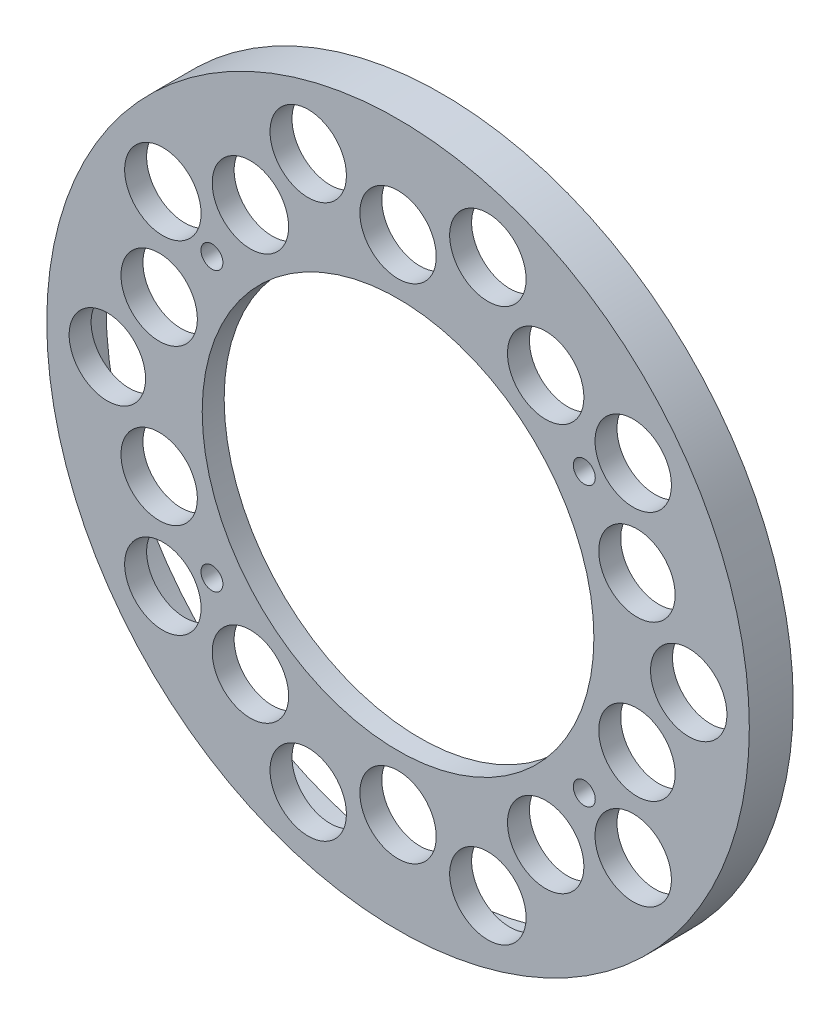
ISO-10303-21;
HEADER;
FILE_DESCRIPTION(('STEP AP214'),'2;1');
FILE_NAME('part.step','',(''),(''),'','','');
FILE_SCHEMA(('AUTOMOTIVE_DESIGN { 1 0 10303 214 1 1 1 1 }'));
ENDSEC;
DATA;
#1=APPLICATION_CONTEXT('core data for automotive mechanical design processes');
#2=APPLICATION_PROTOCOL_DEFINITION('international standard','automotive_design',2000,#1);
#3=PRODUCT_CONTEXT('',#1,'mechanical');
#4=PRODUCT('Part','Part','',(#3));
#5=PRODUCT_RELATED_PRODUCT_CATEGORY('part','',(#4));
#6=PRODUCT_DEFINITION_FORMATION('','',#4);
#7=PRODUCT_DEFINITION_CONTEXT('part definition',#1,'design');
#8=PRODUCT_DEFINITION('design','',#6,#7);
#9=PRODUCT_DEFINITION_SHAPE('','',#8);
#10=(LENGTH_UNIT() NAMED_UNIT(*) SI_UNIT(.MILLI.,.METRE.));
#11=(NAMED_UNIT(*) PLANE_ANGLE_UNIT() SI_UNIT($,.RADIAN.));
#12=(NAMED_UNIT(*) SI_UNIT($,.STERADIAN.) SOLID_ANGLE_UNIT());
#13=UNCERTAINTY_MEASURE_WITH_UNIT(LENGTH_MEASURE(1.E-05),#10,'distance_accuracy_value','');
#14=(GEOMETRIC_REPRESENTATION_CONTEXT(3) GLOBAL_UNCERTAINTY_ASSIGNED_CONTEXT((#13)) GLOBAL_UNIT_ASSIGNED_CONTEXT((#10,
#11,#12)) REPRESENTATION_CONTEXT('',''));
#15=CARTESIAN_POINT('',(0.,0.,0.));
#16=DIRECTION('',(0.,0.,1.));
#17=DIRECTION('',(1.,0.,0.));
#18=AXIS2_PLACEMENT_3D('',#15,#16,#17);
#19=CARTESIAN_POINT('',(0.,0.,0.));
#20=DIRECTION('',(0.,0.,1.));
#21=DIRECTION('',(1.,0.,0.));
#22=AXIS2_PLACEMENT_3D('',#19,#20,#21);
#23=PLANE('',#22);
#24=CARTESIAN_POINT('',(0.,0.,0.));
#25=DIRECTION('',(0.,0.,1.));
#26=DIRECTION('',(1.,0.,0.));
#27=AXIS2_PLACEMENT_3D('',#24,#25,#26);
#28=CIRCLE('',#27,56.642);
#29=CARTESIAN_POINT('',(56.642,0.,0.));
#30=VERTEX_POINT('',#29);
#31=EDGE_CURVE('E53',#30,#30,#28,.T.);
#32=ORIENTED_EDGE('',*,*,#31,.T.);
#33=EDGE_LOOP('',(#32));
#34=FACE_BOUND('',#33,.T.);
#35=CARTESIAN_POINT('',(0.,72.644,0.));
#36=DIRECTION('',(0.,0.,1.));
#37=DIRECTION('',(1.,0.,0.));
#38=AXIS2_PLACEMENT_3D('',#35,#36,#37);
#39=CIRCLE('',#38,11.049);
#40=CARTESIAN_POINT('',(11.049,72.644,0.));
#41=VERTEX_POINT('',#40);
#42=EDGE_CURVE('E70',#41,#41,#39,.T.);
#43=ORIENTED_EDGE('',*,*,#42,.T.);
#44=EDGE_LOOP('',(#43));
#45=FACE_BOUND('',#44,.T.);
#46=CARTESIAN_POINT('',(-42.6990718675336,58.7702305393742,0.));
#47=DIRECTION('',(0.,0.,1.));
#48=DIRECTION('',(1.,0.,0.));
#49=AXIS2_PLACEMENT_3D('',#46,#47,#48);
#50=CIRCLE('',#49,11.049);
#51=CARTESIAN_POINT('',(-31.6500718675337,58.7702305393742,0.));
#52=VERTEX_POINT('',#51);
#53=EDGE_CURVE('E71',#52,#52,#50,.T.);
#54=ORIENTED_EDGE('',*,*,#53,.T.);
#55=EDGE_LOOP('',(#54));
#56=FACE_BOUND('',#55,.T.);
#57=CARTESIAN_POINT('',(-69.0885495697449,22.4482305393744,0.));
#58=DIRECTION('',(0.,0.,1.));
#59=DIRECTION('',(1.,0.,0.));
#60=AXIS2_PLACEMENT_3D('',#57,#58,#59);
#61=CIRCLE('',#60,11.049);
#62=CARTESIAN_POINT('',(-58.0395495697449,22.4482305393744,0.));
#63=VERTEX_POINT('',#62);
#64=EDGE_CURVE('E77',#63,#63,#61,.T.);
#65=ORIENTED_EDGE('',*,*,#64,.T.);
#66=EDGE_LOOP('',(#65));
#67=FACE_BOUND('',#66,.T.);
#68=CARTESIAN_POINT('',(-69.0885495697454,-22.448230539373,0.));
#69=DIRECTION('',(0.,0.,1.));
#70=DIRECTION('',(1.,0.,0.));
#71=AXIS2_PLACEMENT_3D('',#68,#69,#70);
#72=CIRCLE('',#71,11.049);
#73=CARTESIAN_POINT('',(-58.0395495697454,-22.448230539373,0.));
#74=VERTEX_POINT('',#73);
#75=EDGE_CURVE('E78',#74,#74,#72,.T.);
#76=ORIENTED_EDGE('',*,*,#75,.T.);
#77=EDGE_LOOP('',(#76));
#78=FACE_BOUND('',#77,.T.);
#79=CARTESIAN_POINT('',(-42.699071867535,-58.7702305393733,0.));
#80=DIRECTION('',(0.,0.,1.));
#81=DIRECTION('',(1.,0.,0.));
#82=AXIS2_PLACEMENT_3D('',#79,#80,#81);
#83=CIRCLE('',#82,11.049);
#84=CARTESIAN_POINT('',(-31.6500718675349,-58.7702305393733,0.));
#85=VERTEX_POINT('',#84);
#86=EDGE_CURVE('E81',#85,#85,#83,.T.);
#87=ORIENTED_EDGE('',*,*,#86,.T.);
#88=EDGE_LOOP('',(#87));
#89=FACE_BOUND('',#88,.T.);
#90=CARTESIAN_POINT('',(-5.07270340757841E-13,-72.644,0.));
#91=DIRECTION('',(0.,0.,1.));
#92=DIRECTION('',(1.,0.,0.));
#93=AXIS2_PLACEMENT_3D('',#90,#91,#92);
#94=CIRCLE('',#93,11.049);
#95=CARTESIAN_POINT('',(11.0489999999995,-72.644,0.));
#96=VERTEX_POINT('',#95);
#97=EDGE_CURVE('E89',#96,#96,#94,.T.);
#98=ORIENTED_EDGE('',*,*,#97,.T.);
#99=EDGE_LOOP('',(#98));
#100=FACE_BOUND('',#99,.T.);
#101=CARTESIAN_POINT('',(42.6990718675341,-58.7702305393739,0.));
#102=DIRECTION('',(0.,0.,1.));
#103=DIRECTION('',(1.,0.,0.));
#104=AXIS2_PLACEMENT_3D('',#101,#102,#103);
#105=CIRCLE('',#104,11.049);
#106=CARTESIAN_POINT('',(53.7480718675341,-58.7702305393739,0.));
#107=VERTEX_POINT('',#106);
#108=EDGE_CURVE('E95',#107,#107,#105,.T.);
#109=ORIENTED_EDGE('',*,*,#108,.T.);
#110=EDGE_LOOP('',(#109));
#111=FACE_BOUND('',#110,.T.);
#112=CARTESIAN_POINT('',(69.0885495697451,-22.448230539374,0.));
#113=DIRECTION('',(0.,0.,1.));
#114=DIRECTION('',(1.,0.,0.));
#115=AXIS2_PLACEMENT_3D('',#112,#113,#114);
#116=CIRCLE('',#115,11.049);
#117=CARTESIAN_POINT('',(80.1375495697451,-22.448230539374,0.));
#118=VERTEX_POINT('',#117);
#119=EDGE_CURVE('E98',#118,#118,#116,.T.);
#120=ORIENTED_EDGE('',*,*,#119,.T.);
#121=EDGE_LOOP('',(#120));
#122=FACE_BOUND('',#121,.T.);
#123=CARTESIAN_POINT('',(69.0885495697452,22.4482305393735,0.));
#124=DIRECTION('',(0.,0.,1.));
#125=DIRECTION('',(1.,0.,0.));
#126=AXIS2_PLACEMENT_3D('',#123,#124,#125);
#127=CIRCLE('',#126,11.049);
#128=CARTESIAN_POINT('',(80.1375495697452,22.4482305393735,0.));
#129=VERTEX_POINT('',#128);
#130=EDGE_CURVE('E99',#129,#129,#127,.T.);
#131=ORIENTED_EDGE('',*,*,#130,.T.);
#132=EDGE_LOOP('',(#131));
#133=FACE_BOUND('',#132,.T.);
#134=CARTESIAN_POINT('',(42.6990718675345,58.7702305393736,0.));
#135=DIRECTION('',(0.,0.,1.));
#136=DIRECTION('',(1.,0.,0.));
#137=AXIS2_PLACEMENT_3D('',#134,#135,#136);
#138=CIRCLE('',#137,11.049);
#139=CARTESIAN_POINT('',(53.7480718675345,58.7702305393736,0.));
#140=VERTEX_POINT('',#139);
#141=EDGE_CURVE('E104',#140,#140,#138,.T.);
#142=ORIENTED_EDGE('',*,*,#141,.T.);
#143=EDGE_LOOP('',(#142));
#144=FACE_BOUND('',#143,.T.);
#145=CARTESIAN_POINT('',(84.074,0.,0.));
#146=DIRECTION('',(0.,0.,1.));
#147=DIRECTION('',(1.,0.,0.));
#148=AXIS2_PLACEMENT_3D('',#145,#146,#147);
#149=CIRCLE('',#148,11.049);
#150=CARTESIAN_POINT('',(95.123,0.,0.));
#151=VERTEX_POINT('',#150);
#152=EDGE_CURVE('E108',#151,#151,#149,.T.);
#153=ORIENTED_EDGE('',*,*,#152,.T.);
#154=EDGE_LOOP('',(#153));
#155=FACE_BOUND('',#154,.T.);
#156=CARTESIAN_POINT('',(68.01729478508,49.4174573012365,0.));
#157=DIRECTION('',(0.,0.,1.));
#158=DIRECTION('',(1.,0.,0.));
#159=AXIS2_PLACEMENT_3D('',#156,#157,#158);
#160=CIRCLE('',#159,11.049);
#161=CARTESIAN_POINT('',(79.06629478508,49.4174573012365,0.));
#162=VERTEX_POINT('',#161);
#163=EDGE_CURVE('E115',#162,#162,#160,.T.);
#164=ORIENTED_EDGE('',*,*,#163,.T.);
#165=EDGE_LOOP('',(#164));
#166=FACE_BOUND('',#165,.T.);
#167=CARTESIAN_POINT('',(25.9802947850802,79.9591255509985,0.));
#168=DIRECTION('',(0.,0.,1.));
#169=DIRECTION('',(1.,0.,0.));
#170=AXIS2_PLACEMENT_3D('',#167,#168,#169);
#171=CIRCLE('',#170,11.049);
#172=CARTESIAN_POINT('',(37.0292947850802,79.9591255509985,0.));
#173=VERTEX_POINT('',#172);
#174=EDGE_CURVE('E120',#173,#173,#171,.T.);
#175=ORIENTED_EDGE('',*,*,#174,.T.);
#176=EDGE_LOOP('',(#175));
#177=FACE_BOUND('',#176,.T.);
#178=CARTESIAN_POINT('',(-25.9802947850786,79.959125550999,0.));
#179=DIRECTION('',(0.,0.,1.));
#180=DIRECTION('',(1.,0.,0.));
#181=AXIS2_PLACEMENT_3D('',#178,#179,#180);
#182=CIRCLE('',#181,11.049);
#183=CARTESIAN_POINT('',(-14.9312947850786,79.959125550999,0.));
#184=VERTEX_POINT('',#183);
#185=EDGE_CURVE('E122',#184,#184,#182,.T.);
#186=ORIENTED_EDGE('',*,*,#185,.T.);
#187=EDGE_LOOP('',(#186));
#188=FACE_BOUND('',#187,.T.);
#189=CARTESIAN_POINT('',(-68.0172947850789,49.417457301238,0.));
#190=DIRECTION('',(0.,0.,1.));
#191=DIRECTION('',(1.,0.,0.));
#192=AXIS2_PLACEMENT_3D('',#189,#190,#191);
#193=CIRCLE('',#192,11.049);
#194=CARTESIAN_POINT('',(-56.9682947850789,49.417457301238,0.));
#195=VERTEX_POINT('',#194);
#196=EDGE_CURVE('E123',#195,#195,#193,.T.);
#197=ORIENTED_EDGE('',*,*,#196,.T.);
#198=EDGE_LOOP('',(#197));
#199=FACE_BOUND('',#198,.T.);
#200=CARTESIAN_POINT('',(-84.074,5.87085604163795E-13,0.));
#201=DIRECTION('',(0.,0.,1.));
#202=DIRECTION('',(1.,0.,0.));
#203=AXIS2_PLACEMENT_3D('',#200,#201,#202);
#204=CIRCLE('',#203,11.049);
#205=CARTESIAN_POINT('',(-73.025,5.87085604163795E-13,0.));
#206=VERTEX_POINT('',#205);
#207=EDGE_CURVE('E126',#206,#206,#204,.T.);
#208=ORIENTED_EDGE('',*,*,#207,.T.);
#209=EDGE_LOOP('',(#208));
#210=FACE_BOUND('',#209,.T.);
#211=CARTESIAN_POINT('',(-68.0172947850796,-49.417457301237,0.));
#212=DIRECTION('',(0.,0.,1.));
#213=DIRECTION('',(1.,0.,0.));
#214=AXIS2_PLACEMENT_3D('',#211,#212,#213);
#215=CIRCLE('',#214,11.049);
#216=CARTESIAN_POINT('',(-56.9682947850796,-49.417457301237,0.));
#217=VERTEX_POINT('',#216);
#218=EDGE_CURVE('E134',#217,#217,#215,.T.);
#219=ORIENTED_EDGE('',*,*,#218,.T.);
#220=EDGE_LOOP('',(#219));
#221=FACE_BOUND('',#220,.T.);
#222=CARTESIAN_POINT('',(-25.9802947850797,-79.9591255509986,0.));
#223=DIRECTION('',(0.,0.,1.));
#224=DIRECTION('',(1.,0.,0.));
#225=AXIS2_PLACEMENT_3D('',#222,#223,#224);
#226=CIRCLE('',#225,11.049);
#227=CARTESIAN_POINT('',(-14.9312947850797,-79.9591255509986,0.));
#228=VERTEX_POINT('',#227);
#229=EDGE_CURVE('E140',#228,#228,#226,.T.);
#230=ORIENTED_EDGE('',*,*,#229,.T.);
#231=EDGE_LOOP('',(#230));
#232=FACE_BOUND('',#231,.T.);
#233=CARTESIAN_POINT('',(25.9802947850791,-79.9591255509988,0.));
#234=DIRECTION('',(0.,0.,1.));
#235=DIRECTION('',(1.,0.,0.));
#236=AXIS2_PLACEMENT_3D('',#233,#234,#235);
#237=CIRCLE('',#236,11.049);
#238=CARTESIAN_POINT('',(37.0292947850791,-79.9591255509988,0.));
#239=VERTEX_POINT('',#238);
#240=EDGE_CURVE('E142',#239,#239,#237,.T.);
#241=ORIENTED_EDGE('',*,*,#240,.T.);
#242=EDGE_LOOP('',(#241));
#243=FACE_BOUND('',#242,.T.);
#244=CARTESIAN_POINT('',(68.0172947850793,-49.4174573012375,0.));
#245=DIRECTION('',(0.,0.,1.));
#246=DIRECTION('',(1.,0.,0.));
#247=AXIS2_PLACEMENT_3D('',#244,#245,#246);
#248=CIRCLE('',#247,11.049);
#249=CARTESIAN_POINT('',(79.0662947850793,-49.4174573012375,0.));
#250=VERTEX_POINT('',#249);
#251=EDGE_CURVE('E143',#250,#250,#248,.T.);
#252=ORIENTED_EDGE('',*,*,#251,.T.);
#253=EDGE_LOOP('',(#252));
#254=FACE_BOUND('',#253,.T.);
#255=CARTESIAN_POINT('',(53.8675558965714,40.259,0.));
#256=DIRECTION('',(0.,0.,1.));
#257=DIRECTION('',(1.,0.,0.));
#258=AXIS2_PLACEMENT_3D('',#255,#256,#257);
#259=CIRCLE('',#258,3.175);
#260=CARTESIAN_POINT('',(57.0425558965714,40.259,0.));
#261=VERTEX_POINT('',#260);
#262=EDGE_CURVE('E148',#261,#261,#259,.T.);
#263=ORIENTED_EDGE('',*,*,#262,.T.);
#264=EDGE_LOOP('',(#263));
#265=FACE_BOUND('',#264,.T.);
#266=CARTESIAN_POINT('',(-53.8284441034285,40.259,0.));
#267=DIRECTION('',(0.,0.,1.));
#268=DIRECTION('',(1.,0.,0.));
#269=AXIS2_PLACEMENT_3D('',#266,#267,#268);
#270=CIRCLE('',#269,3.175);
#271=CARTESIAN_POINT('',(-50.6534441034285,40.259,0.));
#272=VERTEX_POINT('',#271);
#273=EDGE_CURVE('E151',#272,#272,#270,.T.);
#274=ORIENTED_EDGE('',*,*,#273,.T.);
#275=EDGE_LOOP('',(#274));
#276=FACE_BOUND('',#275,.T.);
#277=CARTESIAN_POINT('',(-53.8284441034285,-40.259,0.));
#278=DIRECTION('',(0.,0.,1.));
#279=DIRECTION('',(1.,0.,0.));
#280=AXIS2_PLACEMENT_3D('',#277,#278,#279);
#281=CIRCLE('',#280,3.175);
#282=CARTESIAN_POINT('',(-50.6534441034285,-40.259,0.));
#283=VERTEX_POINT('',#282);
#284=EDGE_CURVE('E157',#283,#283,#281,.T.);
#285=ORIENTED_EDGE('',*,*,#284,.T.);
#286=EDGE_LOOP('',(#285));
#287=FACE_BOUND('',#286,.T.);
#288=CARTESIAN_POINT('',(53.8675558965714,-40.259,0.));
#289=DIRECTION('',(0.,0.,1.));
#290=DIRECTION('',(1.,0.,0.));
#291=AXIS2_PLACEMENT_3D('',#288,#289,#290);
#292=CIRCLE('',#291,3.175);
#293=CARTESIAN_POINT('',(57.0425558965714,-40.259,0.));
#294=VERTEX_POINT('',#293);
#295=EDGE_CURVE('E47',#294,#294,#292,.T.);
#296=ORIENTED_EDGE('',*,*,#295,.T.);
#297=EDGE_LOOP('',(#296));
#298=FACE_BOUND('',#297,.T.);
#299=CARTESIAN_POINT('',(0.,0.,0.));
#300=DIRECTION('',(0.,0.,-1.));
#301=DIRECTION('',(-1.,0.,0.));
#302=AXIS2_PLACEMENT_3D('',#299,#300,#301);
#303=CIRCLE('',#302,97.155);
#304=CARTESIAN_POINT('',(-97.155,0.,0.));
#305=VERTEX_POINT('',#304);
#306=EDGE_CURVE('E289',#305,#305,#303,.T.);
#307=ORIENTED_EDGE('',*,*,#306,.T.);
#308=EDGE_LOOP('',(#307));
#309=FACE_BOUND('',#308,.T.);
#310=ADVANCED_FACE('F44',(#34,#45,#56,#67,#78,#89,#100,#111,#122,#133,#144,#155,#166,#177,#188,
#199,#210,#221,#232,#243,#254,#265,#276,#287,#298,#309),#23,.F.);
#311=CARTESIAN_POINT('',(0.,0.,6.35));
#312=DIRECTION('',(0.,0.,-1.));
#313=DIRECTION('',(-1.,0.,0.));
#314=AXIS2_PLACEMENT_3D('',#311,#312,#313);
#315=CYLINDRICAL_SURFACE('',#314,101.6);
#316=CARTESIAN_POINT('',(0.,0.,6.35));
#317=DIRECTION('',(0.,0.,1.));
#318=DIRECTION('',(1.,0.,0.));
#319=AXIS2_PLACEMENT_3D('',#316,#317,#318);
#320=CIRCLE('',#319,101.6);
#321=CARTESIAN_POINT('',(101.6,0.,6.35));
#322=VERTEX_POINT('',#321);
#323=EDGE_CURVE('E10',#322,#322,#320,.T.);
#324=ORIENTED_EDGE('',*,*,#323,.F.);
#325=EDGE_LOOP('',(#324));
#326=FACE_BOUND('',#325,.T.);
#327=CARTESIAN_POINT('',(0.,0.,-6.35));
#328=DIRECTION('',(0.,0.,-1.));
#329=DIRECTION('',(-1.,0.,0.));
#330=AXIS2_PLACEMENT_3D('',#327,#328,#329);
#331=CIRCLE('',#330,101.6);
#332=CARTESIAN_POINT('',(-101.6,0.,-6.35));
#333=VERTEX_POINT('',#332);
#334=EDGE_CURVE('E279',#333,#333,#331,.T.);
#335=ORIENTED_EDGE('',*,*,#334,.F.);
#336=EDGE_LOOP('',(#335));
#337=FACE_BOUND('',#336,.T.);
#338=ADVANCED_FACE('F50',(#326,#337),#315,.T.);
#339=CARTESIAN_POINT('',(0.,0.,6.35));
#340=DIRECTION('',(0.,0.,1.));
#341=DIRECTION('',(1.,0.,0.));
#342=AXIS2_PLACEMENT_3D('',#339,#340,#341);
#343=PLANE('',#342);
#344=CARTESIAN_POINT('',(53.8675558965714,-40.259,6.35));
#345=DIRECTION('',(0.,0.,1.));
#346=DIRECTION('',(1.,0.,0.));
#347=AXIS2_PLACEMENT_3D('',#344,#345,#346);
#348=CIRCLE('',#347,3.175);
#349=CARTESIAN_POINT('',(57.0425558965714,-40.259,6.35));
#350=VERTEX_POINT('',#349);
#351=EDGE_CURVE('E273',#350,#350,#348,.T.);
#352=ORIENTED_EDGE('',*,*,#351,.F.);
#353=EDGE_LOOP('',(#352));
#354=FACE_BOUND('',#353,.T.);
#355=CARTESIAN_POINT('',(-53.8284441034285,-40.259,6.35));
#356=DIRECTION('',(0.,0.,1.));
#357=DIRECTION('',(1.,0.,0.));
#358=AXIS2_PLACEMENT_3D('',#355,#356,#357);
#359=CIRCLE('',#358,3.175);
#360=CARTESIAN_POINT('',(-50.6534441034285,-40.259,6.35));
#361=VERTEX_POINT('',#360);
#362=EDGE_CURVE('E268',#361,#361,#359,.T.);
#363=ORIENTED_EDGE('',*,*,#362,.F.);
#364=EDGE_LOOP('',(#363));
#365=FACE_BOUND('',#364,.T.);
#366=CARTESIAN_POINT('',(-53.8284441034285,40.259,6.35));
#367=DIRECTION('',(0.,0.,1.));
#368=DIRECTION('',(1.,0.,0.));
#369=AXIS2_PLACEMENT_3D('',#366,#367,#368);
#370=CIRCLE('',#369,3.175);
#371=CARTESIAN_POINT('',(-50.6534441034285,40.259,6.35));
#372=VERTEX_POINT('',#371);
#373=EDGE_CURVE('E261',#372,#372,#370,.T.);
#374=ORIENTED_EDGE('',*,*,#373,.F.);
#375=EDGE_LOOP('',(#374));
#376=FACE_BOUND('',#375,.T.);
#377=CARTESIAN_POINT('',(53.8675558965714,40.259,6.35));
#378=DIRECTION('',(0.,0.,1.));
#379=DIRECTION('',(1.,0.,0.));
#380=AXIS2_PLACEMENT_3D('',#377,#378,#379);
#381=CIRCLE('',#380,3.175);
#382=CARTESIAN_POINT('',(57.0425558965714,40.259,6.35));
#383=VERTEX_POINT('',#382);
#384=EDGE_CURVE('E153',#383,#383,#381,.T.);
#385=ORIENTED_EDGE('',*,*,#384,.F.);
#386=EDGE_LOOP('',(#385));
#387=FACE_BOUND('',#386,.T.);
#388=CARTESIAN_POINT('',(68.0172947850793,-49.4174573012375,6.35));
#389=DIRECTION('',(0.,0.,1.));
#390=DIRECTION('',(1.,0.,0.));
#391=AXIS2_PLACEMENT_3D('',#388,#389,#390);
#392=CIRCLE('',#391,11.049);
#393=CARTESIAN_POINT('',(79.0662947850793,-49.4174573012375,6.35));
#394=VERTEX_POINT('',#393);
#395=EDGE_CURVE('E184',#394,#394,#392,.T.);
#396=ORIENTED_EDGE('',*,*,#395,.F.);
#397=EDGE_LOOP('',(#396));
#398=FACE_BOUND('',#397,.T.);
#399=CARTESIAN_POINT('',(25.9802947850791,-79.9591255509988,6.35));
#400=DIRECTION('',(0.,0.,1.));
#401=DIRECTION('',(1.,0.,0.));
#402=AXIS2_PLACEMENT_3D('',#399,#400,#401);
#403=CIRCLE('',#402,11.049);
#404=CARTESIAN_POINT('',(37.0292947850791,-79.9591255509988,6.35));
#405=VERTEX_POINT('',#404);
#406=EDGE_CURVE('E189',#405,#405,#403,.T.);
#407=ORIENTED_EDGE('',*,*,#406,.F.);
#408=EDGE_LOOP('',(#407));
#409=FACE_BOUND('',#408,.T.);
#410=CARTESIAN_POINT('',(-25.9802947850797,-79.9591255509986,6.35));
#411=DIRECTION('',(0.,0.,1.));
#412=DIRECTION('',(1.,0.,0.));
#413=AXIS2_PLACEMENT_3D('',#410,#411,#412);
#414=CIRCLE('',#413,11.049);
#415=CARTESIAN_POINT('',(-14.9312947850797,-79.9591255509986,6.35));
#416=VERTEX_POINT('',#415);
#417=EDGE_CURVE('E195',#416,#416,#414,.T.);
#418=ORIENTED_EDGE('',*,*,#417,.F.);
#419=EDGE_LOOP('',(#418));
#420=FACE_BOUND('',#419,.T.);
#421=CARTESIAN_POINT('',(-68.0172947850796,-49.417457301237,6.35));
#422=DIRECTION('',(0.,0.,1.));
#423=DIRECTION('',(1.,0.,0.));
#424=AXIS2_PLACEMENT_3D('',#421,#422,#423);
#425=CIRCLE('',#424,11.049);
#426=CARTESIAN_POINT('',(-56.9682947850796,-49.417457301237,6.35));
#427=VERTEX_POINT('',#426);
#428=EDGE_CURVE('E197',#427,#427,#425,.T.);
#429=ORIENTED_EDGE('',*,*,#428,.F.);
#430=EDGE_LOOP('',(#429));
#431=FACE_BOUND('',#430,.T.);
#432=CARTESIAN_POINT('',(-84.074,5.87085604163795E-13,6.35));
#433=DIRECTION('',(0.,0.,1.));
#434=DIRECTION('',(1.,0.,0.));
#435=AXIS2_PLACEMENT_3D('',#432,#433,#434);
#436=CIRCLE('',#435,11.049);
#437=CARTESIAN_POINT('',(-73.025,5.87085604163795E-13,6.35));
#438=VERTEX_POINT('',#437);
#439=EDGE_CURVE('E196',#438,#438,#436,.T.);
#440=ORIENTED_EDGE('',*,*,#439,.F.);
#441=EDGE_LOOP('',(#440));
#442=FACE_BOUND('',#441,.T.);
#443=CARTESIAN_POINT('',(-68.0172947850789,49.417457301238,6.35));
#444=DIRECTION('',(0.,0.,1.));
#445=DIRECTION('',(1.,0.,0.));
#446=AXIS2_PLACEMENT_3D('',#443,#444,#445);
#447=CIRCLE('',#446,11.049);
#448=CARTESIAN_POINT('',(-56.9682947850789,49.417457301238,6.35));
#449=VERTEX_POINT('',#448);
#450=EDGE_CURVE('E202',#449,#449,#447,.T.);
#451=ORIENTED_EDGE('',*,*,#450,.F.);
#452=EDGE_LOOP('',(#451));
#453=FACE_BOUND('',#452,.T.);
#454=CARTESIAN_POINT('',(-25.9802947850786,79.959125550999,6.35));
#455=DIRECTION('',(0.,0.,1.));
#456=DIRECTION('',(1.,0.,0.));
#457=AXIS2_PLACEMENT_3D('',#454,#455,#456);
#458=CIRCLE('',#457,11.049);
#459=CARTESIAN_POINT('',(-14.9312947850786,79.959125550999,6.35));
#460=VERTEX_POINT('',#459);
#461=EDGE_CURVE('E179',#460,#460,#458,.T.);
#462=ORIENTED_EDGE('',*,*,#461,.F.);
#463=EDGE_LOOP('',(#462));
#464=FACE_BOUND('',#463,.T.);
#465=CARTESIAN_POINT('',(25.9802947850802,79.9591255509985,6.35));
#466=DIRECTION('',(0.,0.,1.));
#467=DIRECTION('',(1.,0.,0.));
#468=AXIS2_PLACEMENT_3D('',#465,#466,#467);
#469=CIRCLE('',#468,11.049);
#470=CARTESIAN_POINT('',(37.0292947850802,79.9591255509985,6.35));
#471=VERTEX_POINT('',#470);
#472=EDGE_CURVE('E175',#471,#471,#469,.T.);
#473=ORIENTED_EDGE('',*,*,#472,.F.);
#474=EDGE_LOOP('',(#473));
#475=FACE_BOUND('',#474,.T.);
#476=CARTESIAN_POINT('',(68.01729478508,49.4174573012365,6.35));
#477=DIRECTION('',(0.,0.,1.));
#478=DIRECTION('',(1.,0.,0.));
#479=AXIS2_PLACEMENT_3D('',#476,#477,#478);
#480=CIRCLE('',#479,11.049);
#481=CARTESIAN_POINT('',(79.06629478508,49.4174573012365,6.35));
#482=VERTEX_POINT('',#481);
#483=EDGE_CURVE('E168',#482,#482,#480,.T.);
#484=ORIENTED_EDGE('',*,*,#483,.F.);
#485=EDGE_LOOP('',(#484));
#486=FACE_BOUND('',#485,.T.);
#487=CARTESIAN_POINT('',(84.074,0.,6.35));
#488=DIRECTION('',(0.,0.,1.));
#489=DIRECTION('',(1.,0.,0.));
#490=AXIS2_PLACEMENT_3D('',#487,#488,#489);
#491=CIRCLE('',#490,11.049);
#492=CARTESIAN_POINT('',(95.123,0.,6.35));
#493=VERTEX_POINT('',#492);
#494=EDGE_CURVE('E113',#493,#493,#491,.T.);
#495=ORIENTED_EDGE('',*,*,#494,.F.);
#496=EDGE_LOOP('',(#495));
#497=FACE_BOUND('',#496,.T.);
#498=CARTESIAN_POINT('',(42.6990718675345,58.7702305393736,6.35));
#499=DIRECTION('',(0.,0.,1.));
#500=DIRECTION('',(1.,0.,0.));
#501=AXIS2_PLACEMENT_3D('',#498,#499,#500);
#502=CIRCLE('',#501,11.049);
#503=CARTESIAN_POINT('',(53.7480718675345,58.7702305393736,6.35));
#504=VERTEX_POINT('',#503);
#505=EDGE_CURVE('E217',#504,#504,#502,.T.);
#506=ORIENTED_EDGE('',*,*,#505,.F.);
#507=EDGE_LOOP('',(#506));
#508=FACE_BOUND('',#507,.T.);
#509=CARTESIAN_POINT('',(69.0885495697452,22.4482305393735,6.35));
#510=DIRECTION('',(0.,0.,1.));
#511=DIRECTION('',(1.,0.,0.));
#512=AXIS2_PLACEMENT_3D('',#509,#510,#511);
#513=CIRCLE('',#512,11.049);
#514=CARTESIAN_POINT('',(80.1375495697452,22.4482305393735,6.35));
#515=VERTEX_POINT('',#514);
#516=EDGE_CURVE('E216',#515,#515,#513,.T.);
#517=ORIENTED_EDGE('',*,*,#516,.F.);
#518=EDGE_LOOP('',(#517));
#519=FACE_BOUND('',#518,.T.);
#520=CARTESIAN_POINT('',(69.0885495697451,-22.448230539374,6.35));
#521=DIRECTION('',(0.,0.,1.));
#522=DIRECTION('',(1.,0.,0.));
#523=AXIS2_PLACEMENT_3D('',#520,#521,#522);
#524=CIRCLE('',#523,11.049);
#525=CARTESIAN_POINT('',(80.1375495697451,-22.448230539374,6.35));
#526=VERTEX_POINT('',#525);
#527=EDGE_CURVE('E222',#526,#526,#524,.T.);
#528=ORIENTED_EDGE('',*,*,#527,.F.);
#529=EDGE_LOOP('',(#528));
#530=FACE_BOUND('',#529,.T.);
#531=CARTESIAN_POINT('',(42.6990718675341,-58.7702305393739,6.35));
#532=DIRECTION('',(0.,0.,1.));
#533=DIRECTION('',(1.,0.,0.));
#534=AXIS2_PLACEMENT_3D('',#531,#532,#533);
#535=CIRCLE('',#534,11.049);
#536=CARTESIAN_POINT('',(53.7480718675341,-58.7702305393739,6.35));
#537=VERTEX_POINT('',#536);
#538=EDGE_CURVE('E227',#537,#537,#535,.T.);
#539=ORIENTED_EDGE('',*,*,#538,.F.);
#540=EDGE_LOOP('',(#539));
#541=FACE_BOUND('',#540,.T.);
#542=CARTESIAN_POINT('',(-5.07270340757841E-13,-72.644,6.35));
#543=DIRECTION('',(0.,0.,1.));
#544=DIRECTION('',(1.,0.,0.));
#545=AXIS2_PLACEMENT_3D('',#542,#543,#544);
#546=CIRCLE('',#545,11.049);
#547=CARTESIAN_POINT('',(11.0489999999995,-72.644,6.35));
#548=VERTEX_POINT('',#547);
#549=EDGE_CURVE('E233',#548,#548,#546,.T.);
#550=ORIENTED_EDGE('',*,*,#549,.F.);
#551=EDGE_LOOP('',(#550));
#552=FACE_BOUND('',#551,.T.);
#553=CARTESIAN_POINT('',(-42.699071867535,-58.7702305393733,6.35));
#554=DIRECTION('',(0.,0.,1.));
#555=DIRECTION('',(1.,0.,0.));
#556=AXIS2_PLACEMENT_3D('',#553,#554,#555);
#557=CIRCLE('',#556,11.049);
#558=CARTESIAN_POINT('',(-31.6500718675349,-58.7702305393733,6.35));
#559=VERTEX_POINT('',#558);
#560=EDGE_CURVE('E232',#559,#559,#557,.T.);
#561=ORIENTED_EDGE('',*,*,#560,.F.);
#562=EDGE_LOOP('',(#561));
#563=FACE_BOUND('',#562,.T.);
#564=CARTESIAN_POINT('',(-69.0885495697454,-22.448230539373,6.35));
#565=DIRECTION('',(0.,0.,1.));
#566=DIRECTION('',(1.,0.,0.));
#567=AXIS2_PLACEMENT_3D('',#564,#565,#566);
#568=CIRCLE('',#567,11.049);
#569=CARTESIAN_POINT('',(-58.0395495697454,-22.448230539373,6.35));
#570=VERTEX_POINT('',#569);
#571=EDGE_CURVE('E237',#570,#570,#568,.T.);
#572=ORIENTED_EDGE('',*,*,#571,.F.);
#573=EDGE_LOOP('',(#572));
#574=FACE_BOUND('',#573,.T.);
#575=CARTESIAN_POINT('',(-69.0885495697449,22.4482305393744,6.35));
#576=DIRECTION('',(0.,0.,1.));
#577=DIRECTION('',(1.,0.,0.));
#578=AXIS2_PLACEMENT_3D('',#575,#576,#577);
#579=CIRCLE('',#578,11.049);
#580=CARTESIAN_POINT('',(-58.0395495697449,22.4482305393744,6.35));
#581=VERTEX_POINT('',#580);
#582=EDGE_CURVE('E213',#581,#581,#579,.T.);
#583=ORIENTED_EDGE('',*,*,#582,.F.);
#584=EDGE_LOOP('',(#583));
#585=FACE_BOUND('',#584,.T.);
#586=CARTESIAN_POINT('',(-42.6990718675336,58.7702305393742,6.35));
#587=DIRECTION('',(0.,0.,1.));
#588=DIRECTION('',(1.,0.,0.));
#589=AXIS2_PLACEMENT_3D('',#586,#587,#588);
#590=CIRCLE('',#589,11.049);
#591=CARTESIAN_POINT('',(-31.6500718675337,58.7702305393742,6.35));
#592=VERTEX_POINT('',#591);
#593=EDGE_CURVE('E146',#592,#592,#590,.T.);
#594=ORIENTED_EDGE('',*,*,#593,.F.);
#595=EDGE_LOOP('',(#594));
#596=FACE_BOUND('',#595,.T.);
#597=CARTESIAN_POINT('',(0.,72.644,6.35));
#598=DIRECTION('',(0.,0.,1.));
#599=DIRECTION('',(1.,0.,0.));
#600=AXIS2_PLACEMENT_3D('',#597,#598,#599);
#601=CIRCLE('',#600,11.049);
#602=CARTESIAN_POINT('',(11.049,72.644,6.35));
#603=VERTEX_POINT('',#602);
#604=EDGE_CURVE('E75',#603,#603,#601,.T.);
#605=ORIENTED_EDGE('',*,*,#604,.F.);
#606=EDGE_LOOP('',(#605));
#607=FACE_BOUND('',#606,.T.);
#608=CARTESIAN_POINT('',(0.,0.,6.35));
#609=DIRECTION('',(0.,0.,1.));
#610=DIRECTION('',(1.,0.,0.));
#611=AXIS2_PLACEMENT_3D('',#608,#609,#610);
#612=CIRCLE('',#611,56.642);
#613=CARTESIAN_POINT('',(56.642,0.,6.35));
#614=VERTEX_POINT('',#613);
#615=EDGE_CURVE('E65',#614,#614,#612,.T.);
#616=ORIENTED_EDGE('',*,*,#615,.F.);
#617=EDGE_LOOP('',(#616));
#618=FACE_BOUND('',#617,.T.);
#619=ORIENTED_EDGE('',*,*,#323,.T.);
#620=EDGE_LOOP('',(#619));
#621=FACE_BOUND('',#620,.T.);
#622=ADVANCED_FACE('F254',(#354,#365,#376,#387,#398,#409,#420,#431,#442,#453,#464,#475,#486,
#497,#508,#519,#530,#541,#552,#563,#574,#585,#596,#607,#618,#621),#343,.T.);
#623=CARTESIAN_POINT('',(0.,0.,-139.954));
#624=DIRECTION('',(0.,0.,1.));
#625=DIRECTION('',(1.,0.,0.));
#626=AXIS2_PLACEMENT_3D('',#623,#624,#625);
#627=CYLINDRICAL_SURFACE('',#626,56.642);
#628=ORIENTED_EDGE('',*,*,#615,.T.);
#629=EDGE_LOOP('',(#628));
#630=FACE_BOUND('',#629,.T.);
#631=ORIENTED_EDGE('',*,*,#31,.F.);
#632=EDGE_LOOP('',(#631));
#633=FACE_BOUND('',#632,.T.);
#634=ADVANCED_FACE('F257',(#630,#633),#627,.F.);
#635=CARTESIAN_POINT('',(0.,72.644,-139.954));
#636=DIRECTION('',(0.,0.,1.));
#637=DIRECTION('',(1.,0.,0.));
#638=AXIS2_PLACEMENT_3D('',#635,#636,#637);
#639=CYLINDRICAL_SURFACE('',#638,11.049);
#640=ORIENTED_EDGE('',*,*,#604,.T.);
#641=EDGE_LOOP('',(#640));
#642=FACE_BOUND('',#641,.T.);
#643=ORIENTED_EDGE('',*,*,#42,.F.);
#644=EDGE_LOOP('',(#643));
#645=FACE_BOUND('',#644,.T.);
#646=ADVANCED_FACE('F249',(#642,#645),#639,.F.);
#647=CARTESIAN_POINT('',(-42.6990718675336,58.7702305393742,-139.954));
#648=DIRECTION('',(0.,0.,1.));
#649=DIRECTION('',(1.,0.,0.));
#650=AXIS2_PLACEMENT_3D('',#647,#648,#649);
#651=CYLINDRICAL_SURFACE('',#650,11.049);
#652=ORIENTED_EDGE('',*,*,#593,.T.);
#653=EDGE_LOOP('',(#652));
#654=FACE_BOUND('',#653,.T.);
#655=ORIENTED_EDGE('',*,*,#53,.F.);
#656=EDGE_LOOP('',(#655));
#657=FACE_BOUND('',#656,.T.);
#658=ADVANCED_FACE('F320',(#654,#657),#651,.F.);
#659=CARTESIAN_POINT('',(-69.0885495697449,22.4482305393744,-139.954));
#660=DIRECTION('',(0.,0.,1.));
#661=DIRECTION('',(1.,0.,0.));
#662=AXIS2_PLACEMENT_3D('',#659,#660,#661);
#663=CYLINDRICAL_SURFACE('',#662,11.049);
#664=ORIENTED_EDGE('',*,*,#582,.T.);
#665=EDGE_LOOP('',(#664));
#666=FACE_BOUND('',#665,.T.);
#667=ORIENTED_EDGE('',*,*,#64,.F.);
#668=EDGE_LOOP('',(#667));
#669=FACE_BOUND('',#668,.T.);
#670=ADVANCED_FACE('F319',(#666,#669),#663,.F.);
#671=CARTESIAN_POINT('',(-69.0885495697454,-22.448230539373,-139.954));
#672=DIRECTION('',(0.,0.,1.));
#673=DIRECTION('',(1.,0.,0.));
#674=AXIS2_PLACEMENT_3D('',#671,#672,#673);
#675=CYLINDRICAL_SURFACE('',#674,11.049);
#676=ORIENTED_EDGE('',*,*,#571,.T.);
#677=EDGE_LOOP('',(#676));
#678=FACE_BOUND('',#677,.T.);
#679=ORIENTED_EDGE('',*,*,#75,.F.);
#680=EDGE_LOOP('',(#679));
#681=FACE_BOUND('',#680,.T.);
#682=ADVANCED_FACE('F322',(#678,#681),#675,.F.);
#683=CARTESIAN_POINT('',(-42.699071867535,-58.7702305393733,-139.954));
#684=DIRECTION('',(0.,0.,1.));
#685=DIRECTION('',(1.,0.,0.));
#686=AXIS2_PLACEMENT_3D('',#683,#684,#685);
#687=CYLINDRICAL_SURFACE('',#686,11.049);
#688=ORIENTED_EDGE('',*,*,#560,.T.);
#689=EDGE_LOOP('',(#688));
#690=FACE_BOUND('',#689,.T.);
#691=ORIENTED_EDGE('',*,*,#86,.F.);
#692=EDGE_LOOP('',(#691));
#693=FACE_BOUND('',#692,.T.);
#694=ADVANCED_FACE('F323',(#690,#693),#687,.F.);
#695=CARTESIAN_POINT('',(-5.07270340757841E-13,-72.644,-139.954));
#696=DIRECTION('',(0.,0.,1.));
#697=DIRECTION('',(1.,0.,0.));
#698=AXIS2_PLACEMENT_3D('',#695,#696,#697);
#699=CYLINDRICAL_SURFACE('',#698,11.049);
#700=ORIENTED_EDGE('',*,*,#549,.T.);
#701=EDGE_LOOP('',(#700));
#702=FACE_BOUND('',#701,.T.);
#703=ORIENTED_EDGE('',*,*,#97,.F.);
#704=EDGE_LOOP('',(#703));
#705=FACE_BOUND('',#704,.T.);
#706=ADVANCED_FACE('F326',(#702,#705),#699,.F.);
#707=CARTESIAN_POINT('',(42.6990718675341,-58.7702305393739,-139.954));
#708=DIRECTION('',(0.,0.,1.));
#709=DIRECTION('',(1.,0.,0.));
#710=AXIS2_PLACEMENT_3D('',#707,#708,#709);
#711=CYLINDRICAL_SURFACE('',#710,11.049);
#712=ORIENTED_EDGE('',*,*,#538,.T.);
#713=EDGE_LOOP('',(#712));
#714=FACE_BOUND('',#713,.T.);
#715=ORIENTED_EDGE('',*,*,#108,.F.);
#716=EDGE_LOOP('',(#715));
#717=FACE_BOUND('',#716,.T.);
#718=ADVANCED_FACE('F332',(#714,#717),#711,.F.);
#719=CARTESIAN_POINT('',(69.0885495697451,-22.448230539374,-139.954));
#720=DIRECTION('',(0.,0.,1.));
#721=DIRECTION('',(1.,0.,0.));
#722=AXIS2_PLACEMENT_3D('',#719,#720,#721);
#723=CYLINDRICAL_SURFACE('',#722,11.049);
#724=ORIENTED_EDGE('',*,*,#527,.T.);
#725=EDGE_LOOP('',(#724));
#726=FACE_BOUND('',#725,.T.);
#727=ORIENTED_EDGE('',*,*,#119,.F.);
#728=EDGE_LOOP('',(#727));
#729=FACE_BOUND('',#728,.T.);
#730=ADVANCED_FACE('F340',(#726,#729),#723,.F.);
#731=CARTESIAN_POINT('',(69.0885495697452,22.4482305393735,-139.954));
#732=DIRECTION('',(0.,0.,1.));
#733=DIRECTION('',(1.,0.,0.));
#734=AXIS2_PLACEMENT_3D('',#731,#732,#733);
#735=CYLINDRICAL_SURFACE('',#734,11.049);
#736=ORIENTED_EDGE('',*,*,#516,.T.);
#737=EDGE_LOOP('',(#736));
#738=FACE_BOUND('',#737,.T.);
#739=ORIENTED_EDGE('',*,*,#130,.F.);
#740=EDGE_LOOP('',(#739));
#741=FACE_BOUND('',#740,.T.);
#742=ADVANCED_FACE('F342',(#738,#741),#735,.F.);
#743=CARTESIAN_POINT('',(42.6990718675345,58.7702305393736,-139.954));
#744=DIRECTION('',(0.,0.,1.));
#745=DIRECTION('',(1.,0.,0.));
#746=AXIS2_PLACEMENT_3D('',#743,#744,#745);
#747=CYLINDRICAL_SURFACE('',#746,11.049);
#748=ORIENTED_EDGE('',*,*,#505,.T.);
#749=EDGE_LOOP('',(#748));
#750=FACE_BOUND('',#749,.T.);
#751=ORIENTED_EDGE('',*,*,#141,.F.);
#752=EDGE_LOOP('',(#751));
#753=FACE_BOUND('',#752,.T.);
#754=ADVANCED_FACE('F343',(#750,#753),#747,.F.);
#755=CARTESIAN_POINT('',(84.074,0.,-139.954));
#756=DIRECTION('',(0.,0.,1.));
#757=DIRECTION('',(1.,0.,0.));
#758=AXIS2_PLACEMENT_3D('',#755,#756,#757);
#759=CYLINDRICAL_SURFACE('',#758,11.049);
#760=ORIENTED_EDGE('',*,*,#494,.T.);
#761=EDGE_LOOP('',(#760));
#762=FACE_BOUND('',#761,.T.);
#763=ORIENTED_EDGE('',*,*,#152,.F.);
#764=EDGE_LOOP('',(#763));
#765=FACE_BOUND('',#764,.T.);
#766=ADVANCED_FACE('F346',(#762,#765),#759,.F.);
#767=CARTESIAN_POINT('',(68.01729478508,49.4174573012365,-139.954));
#768=DIRECTION('',(0.,0.,1.));
#769=DIRECTION('',(1.,0.,0.));
#770=AXIS2_PLACEMENT_3D('',#767,#768,#769);
#771=CYLINDRICAL_SURFACE('',#770,11.049);
#772=ORIENTED_EDGE('',*,*,#483,.T.);
#773=EDGE_LOOP('',(#772));
#774=FACE_BOUND('',#773,.T.);
#775=ORIENTED_EDGE('',*,*,#163,.F.);
#776=EDGE_LOOP('',(#775));
#777=FACE_BOUND('',#776,.T.);
#778=ADVANCED_FACE('F358',(#774,#777),#771,.F.);
#779=CARTESIAN_POINT('',(25.9802947850802,79.9591255509985,-139.954));
#780=DIRECTION('',(0.,0.,1.));
#781=DIRECTION('',(1.,0.,0.));
#782=AXIS2_PLACEMENT_3D('',#779,#780,#781);
#783=CYLINDRICAL_SURFACE('',#782,11.049);
#784=ORIENTED_EDGE('',*,*,#472,.T.);
#785=EDGE_LOOP('',(#784));
#786=FACE_BOUND('',#785,.T.);
#787=ORIENTED_EDGE('',*,*,#174,.F.);
#788=EDGE_LOOP('',(#787));
#789=FACE_BOUND('',#788,.T.);
#790=ADVANCED_FACE('F356',(#786,#789),#783,.F.);
#791=CARTESIAN_POINT('',(-25.9802947850786,79.959125550999,-139.954));
#792=DIRECTION('',(0.,0.,1.));
#793=DIRECTION('',(1.,0.,0.));
#794=AXIS2_PLACEMENT_3D('',#791,#792,#793);
#795=CYLINDRICAL_SURFACE('',#794,11.049);
#796=ORIENTED_EDGE('',*,*,#461,.T.);
#797=EDGE_LOOP('',(#796));
#798=FACE_BOUND('',#797,.T.);
#799=ORIENTED_EDGE('',*,*,#185,.F.);
#800=EDGE_LOOP('',(#799));
#801=FACE_BOUND('',#800,.T.);
#802=ADVANCED_FACE('F363',(#798,#801),#795,.F.);
#803=CARTESIAN_POINT('',(-68.0172947850789,49.417457301238,-139.954));
#804=DIRECTION('',(0.,0.,1.));
#805=DIRECTION('',(1.,0.,0.));
#806=AXIS2_PLACEMENT_3D('',#803,#804,#805);
#807=CYLINDRICAL_SURFACE('',#806,11.049);
#808=ORIENTED_EDGE('',*,*,#450,.T.);
#809=EDGE_LOOP('',(#808));
#810=FACE_BOUND('',#809,.T.);
#811=ORIENTED_EDGE('',*,*,#196,.F.);
#812=EDGE_LOOP('',(#811));
#813=FACE_BOUND('',#812,.T.);
#814=ADVANCED_FACE('F362',(#810,#813),#807,.F.);
#815=CARTESIAN_POINT('',(-84.074,5.87085604163795E-13,-139.954));
#816=DIRECTION('',(0.,0.,1.));
#817=DIRECTION('',(1.,0.,0.));
#818=AXIS2_PLACEMENT_3D('',#815,#816,#817);
#819=CYLINDRICAL_SURFACE('',#818,11.049);
#820=ORIENTED_EDGE('',*,*,#439,.T.);
#821=EDGE_LOOP('',(#820));
#822=FACE_BOUND('',#821,.T.);
#823=ORIENTED_EDGE('',*,*,#207,.F.);
#824=EDGE_LOOP('',(#823));
#825=FACE_BOUND('',#824,.T.);
#826=ADVANCED_FACE('F367',(#822,#825),#819,.F.);
#827=CARTESIAN_POINT('',(-68.0172947850796,-49.417457301237,-139.954));
#828=DIRECTION('',(0.,0.,1.));
#829=DIRECTION('',(1.,0.,0.));
#830=AXIS2_PLACEMENT_3D('',#827,#828,#829);
#831=CYLINDRICAL_SURFACE('',#830,11.049);
#832=ORIENTED_EDGE('',*,*,#428,.T.);
#833=EDGE_LOOP('',(#832));
#834=FACE_BOUND('',#833,.T.);
#835=ORIENTED_EDGE('',*,*,#218,.F.);
#836=EDGE_LOOP('',(#835));
#837=FACE_BOUND('',#836,.T.);
#838=ADVANCED_FACE('F373',(#834,#837),#831,.F.);
#839=CARTESIAN_POINT('',(-25.9802947850797,-79.9591255509986,-139.954));
#840=DIRECTION('',(0.,0.,1.));
#841=DIRECTION('',(1.,0.,0.));
#842=AXIS2_PLACEMENT_3D('',#839,#840,#841);
#843=CYLINDRICAL_SURFACE('',#842,11.049);
#844=ORIENTED_EDGE('',*,*,#417,.T.);
#845=EDGE_LOOP('',(#844));
#846=FACE_BOUND('',#845,.T.);
#847=ORIENTED_EDGE('',*,*,#229,.F.);
#848=EDGE_LOOP('',(#847));
#849=FACE_BOUND('',#848,.T.);
#850=ADVANCED_FACE('F380',(#846,#849),#843,.F.);
#851=CARTESIAN_POINT('',(25.9802947850791,-79.9591255509988,-139.954));
#852=DIRECTION('',(0.,0.,1.));
#853=DIRECTION('',(1.,0.,0.));
#854=AXIS2_PLACEMENT_3D('',#851,#852,#853);
#855=CYLINDRICAL_SURFACE('',#854,11.049);
#856=ORIENTED_EDGE('',*,*,#406,.T.);
#857=EDGE_LOOP('',(#856));
#858=FACE_BOUND('',#857,.T.);
#859=ORIENTED_EDGE('',*,*,#240,.F.);
#860=EDGE_LOOP('',(#859));
#861=FACE_BOUND('',#860,.T.);
#862=ADVANCED_FACE('F382',(#858,#861),#855,.F.);
#863=CARTESIAN_POINT('',(68.0172947850793,-49.4174573012375,-139.954));
#864=DIRECTION('',(0.,0.,1.));
#865=DIRECTION('',(1.,0.,0.));
#866=AXIS2_PLACEMENT_3D('',#863,#864,#865);
#867=CYLINDRICAL_SURFACE('',#866,11.049);
#868=ORIENTED_EDGE('',*,*,#395,.T.);
#869=EDGE_LOOP('',(#868));
#870=FACE_BOUND('',#869,.T.);
#871=ORIENTED_EDGE('',*,*,#251,.F.);
#872=EDGE_LOOP('',(#871));
#873=FACE_BOUND('',#872,.T.);
#874=ADVANCED_FACE('F383',(#870,#873),#867,.F.);
#875=CARTESIAN_POINT('',(53.8675558965714,40.259,-139.954));
#876=DIRECTION('',(0.,0.,1.));
#877=DIRECTION('',(1.,0.,0.));
#878=AXIS2_PLACEMENT_3D('',#875,#876,#877);
#879=CYLINDRICAL_SURFACE('',#878,3.175);
#880=ORIENTED_EDGE('',*,*,#384,.T.);
#881=EDGE_LOOP('',(#880));
#882=FACE_BOUND('',#881,.T.);
#883=ORIENTED_EDGE('',*,*,#262,.F.);
#884=EDGE_LOOP('',(#883));
#885=FACE_BOUND('',#884,.T.);
#886=ADVANCED_FACE('F386',(#882,#885),#879,.F.);
#887=CARTESIAN_POINT('',(-53.8284441034285,40.259,-139.954));
#888=DIRECTION('',(0.,0.,1.));
#889=DIRECTION('',(1.,0.,0.));
#890=AXIS2_PLACEMENT_3D('',#887,#888,#889);
#891=CYLINDRICAL_SURFACE('',#890,3.175);
#892=ORIENTED_EDGE('',*,*,#373,.T.);
#893=EDGE_LOOP('',(#892));
#894=FACE_BOUND('',#893,.T.);
#895=ORIENTED_EDGE('',*,*,#273,.F.);
#896=EDGE_LOOP('',(#895));
#897=FACE_BOUND('',#896,.T.);
#898=ADVANCED_FACE('F393',(#894,#897),#891,.F.);
#899=CARTESIAN_POINT('',(-53.8284441034285,-40.259,-139.954));
#900=DIRECTION('',(0.,0.,1.));
#901=DIRECTION('',(1.,0.,0.));
#902=AXIS2_PLACEMENT_3D('',#899,#900,#901);
#903=CYLINDRICAL_SURFACE('',#902,3.175);
#904=ORIENTED_EDGE('',*,*,#362,.T.);
#905=EDGE_LOOP('',(#904));
#906=FACE_BOUND('',#905,.T.);
#907=ORIENTED_EDGE('',*,*,#284,.F.);
#908=EDGE_LOOP('',(#907));
#909=FACE_BOUND('',#908,.T.);
#910=ADVANCED_FACE('F397',(#906,#909),#903,.F.);
#911=CARTESIAN_POINT('',(53.8675558965714,-40.259,-139.954));
#912=DIRECTION('',(0.,0.,1.));
#913=DIRECTION('',(1.,0.,0.));
#914=AXIS2_PLACEMENT_3D('',#911,#912,#913);
#915=CYLINDRICAL_SURFACE('',#914,3.175);
#916=ORIENTED_EDGE('',*,*,#351,.T.);
#917=EDGE_LOOP('',(#916));
#918=FACE_BOUND('',#917,.T.);
#919=ORIENTED_EDGE('',*,*,#295,.F.);
#920=EDGE_LOOP('',(#919));
#921=FACE_BOUND('',#920,.T.);
#922=ADVANCED_FACE('F302',(#918,#921),#915,.F.);
#923=CARTESIAN_POINT('',(0.,0.,-6.35));
#924=DIRECTION('',(0.,0.,-1.));
#925=DIRECTION('',(-1.,0.,0.));
#926=AXIS2_PLACEMENT_3D('',#923,#924,#925);
#927=PLANE('',#926);
#928=ORIENTED_EDGE('',*,*,#334,.T.);
#929=EDGE_LOOP('',(#928));
#930=FACE_BOUND('',#929,.T.);
#931=CARTESIAN_POINT('',(0.,0.,-6.35));
#932=DIRECTION('',(0.,0.,-1.));
#933=DIRECTION('',(-1.,0.,0.));
#934=AXIS2_PLACEMENT_3D('',#931,#932,#933);
#935=CIRCLE('',#934,97.155);
#936=CARTESIAN_POINT('',(-97.155,0.,-6.35));
#937=VERTEX_POINT('',#936);
#938=EDGE_CURVE('E283',#937,#937,#935,.T.);
#939=ORIENTED_EDGE('',*,*,#938,.F.);
#940=EDGE_LOOP('',(#939));
#941=FACE_BOUND('',#940,.T.);
#942=ADVANCED_FACE('F297',(#930,#941),#927,.T.);
#943=CARTESIAN_POINT('',(0.,0.,-6.35));
#944=DIRECTION('',(0.,0.,1.));
#945=DIRECTION('',(1.,0.,0.));
#946=AXIS2_PLACEMENT_3D('',#943,#944,#945);
#947=CYLINDRICAL_SURFACE('',#946,97.155);
#948=ORIENTED_EDGE('',*,*,#938,.T.);
#949=EDGE_LOOP('',(#948));
#950=FACE_BOUND('',#949,.T.);
#951=ORIENTED_EDGE('',*,*,#306,.F.);
#952=EDGE_LOOP('',(#951));
#953=FACE_BOUND('',#952,.T.);
#954=ADVANCED_FACE('F296',(#950,#953),#947,.F.);
#955=CLOSED_SHELL('',(#310,#338,#622,#634,#646,#658,#670,#682,#694,#706,#718,#730,#742,#754,
#766,#778,#790,#802,#814,#826,#838,#850,#862,#874,#886,#898,#910,#922,#942,#954));
#956=MANIFOLD_SOLID_BREP('B2',#955);
#957=ADVANCED_BREP_SHAPE_REPRESENTATION('',(#18,#956),#14);
#958=SHAPE_DEFINITION_REPRESENTATION(#9,#957);
ENDSEC;
END-ISO-10303-21;
